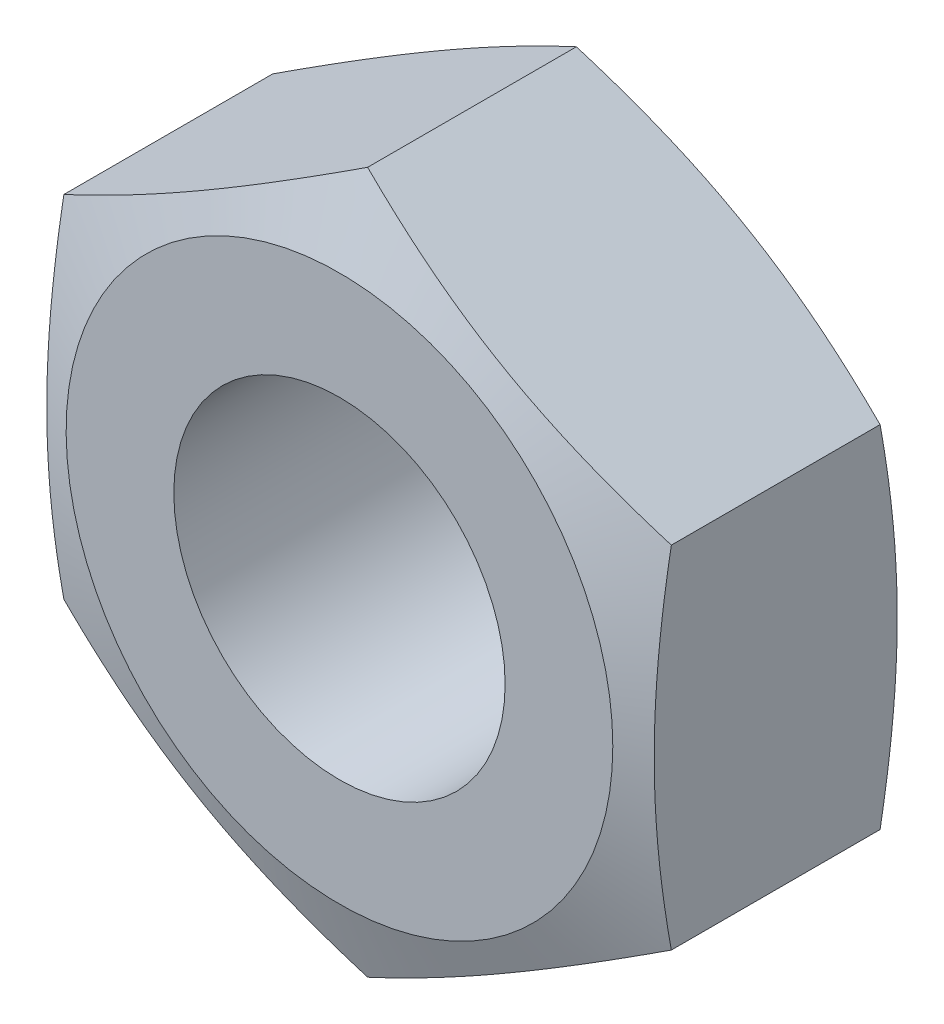
ISO-10303-21;
HEADER;
FILE_DESCRIPTION(('STEP AP214'),'2;1');
FILE_NAME('part.step','',(''),(''),'','','');
FILE_SCHEMA(('AUTOMOTIVE_DESIGN { 1 0 10303 214 1 1 1 1 }'));
ENDSEC;
DATA;
#1=APPLICATION_CONTEXT('core data for automotive mechanical design processes');
#2=APPLICATION_PROTOCOL_DEFINITION('international standard','automotive_design',2000,#1);
#3=PRODUCT_CONTEXT('',#1,'mechanical');
#4=PRODUCT('Part','Part','',(#3));
#5=PRODUCT_RELATED_PRODUCT_CATEGORY('part','',(#4));
#6=PRODUCT_DEFINITION_FORMATION('','',#4);
#7=PRODUCT_DEFINITION_CONTEXT('part definition',#1,'design');
#8=PRODUCT_DEFINITION('design','',#6,#7);
#9=PRODUCT_DEFINITION_SHAPE('','',#8);
#10=(LENGTH_UNIT() NAMED_UNIT(*) SI_UNIT(.MILLI.,.METRE.));
#11=(NAMED_UNIT(*) PLANE_ANGLE_UNIT() SI_UNIT($,.RADIAN.));
#12=(NAMED_UNIT(*) SI_UNIT($,.STERADIAN.) SOLID_ANGLE_UNIT());
#13=UNCERTAINTY_MEASURE_WITH_UNIT(LENGTH_MEASURE(1.E-05),#10,'distance_accuracy_value','');
#14=(GEOMETRIC_REPRESENTATION_CONTEXT(3) GLOBAL_UNCERTAINTY_ASSIGNED_CONTEXT((#13)) GLOBAL_UNIT_ASSIGNED_CONTEXT((#10,
#11,#12)) REPRESENTATION_CONTEXT('',''));
#15=CARTESIAN_POINT('',(0.,0.,0.));
#16=DIRECTION('',(0.,0.,1.));
#17=DIRECTION('',(1.,0.,0.));
#18=AXIS2_PLACEMENT_3D('',#15,#16,#17);
#19=CARTESIAN_POINT('',(2.75,1.58771324027147,2.4));
#20=DIRECTION('',(-0.5,-0.866025403784439,0.));
#21=DIRECTION('',(0.866025403784439,-0.5,0.));
#22=AXIS2_PLACEMENT_3D('',#19,#20,#21);
#23=PLANE('',#22);
#24=DIRECTION('',(0.,0.,-1.));
#25=VECTOR('',#24,1.);
#26=CARTESIAN_POINT('',(2.75,1.58771324027147,2.4));
#27=LINE('',#26,#25);
#28=CARTESIAN_POINT('',(2.75,1.58771324027147,2.14506560979054));
#29=VERTEX_POINT('',#28);
#30=CARTESIAN_POINT('',(2.75,1.58771324027147,0.254934390209461));
#31=VERTEX_POINT('',#30);
#32=EDGE_CURVE('E111',#29,#31,#27,.T.);
#33=ORIENTED_EDGE('',*,*,#32,.T.);
#34=CARTESIAN_POINT('',(2.7502,1.58759777021763,0.254976420164342));
#35=CARTESIAN_POINT('',(2.63630000012268,1.6533579658075,0.231031192897424));
#36=CARTESIAN_POINT('',(2.52202437371804,1.71933502947404,0.209248749090023));
#37=CARTESIAN_POINT('',(2.29272998795685,1.85171820481693,0.170925767770384));
#38=CARTESIAN_POINT('',(2.17771071836237,1.9181246110793,0.154389333313849));
#39=CARTESIAN_POINT('',(1.94820567615072,2.05062940898057,0.127642073357742));
#40=CARTESIAN_POINT('',(1.83372514644431,2.11672477362354,0.117372900159257));
#41=CARTESIAN_POINT('',(1.60449633341729,2.2490700905307,0.103599039319051));
#42=CARTESIAN_POINT('',(1.48974816670865,2.31531997546895,0.100091814423204));
#43=CARTESIAN_POINT('',(1.26025183329135,2.44781974534546,0.100091814423204));
#44=CARTESIAN_POINT('',(1.14550366658271,2.51406963028371,0.103599039319051));
#45=CARTESIAN_POINT('',(0.916274853555694,2.64641494719088,0.117372900159256));
#46=CARTESIAN_POINT('',(0.801794323849281,2.71251031183385,0.127642073357742));
#47=CARTESIAN_POINT('',(0.572289281637633,2.84501510973512,0.154389333313849));
#48=CARTESIAN_POINT('',(0.457270012043154,2.91142151599748,0.170925767770384));
#49=CARTESIAN_POINT('',(0.227975626281962,3.04380469134038,0.209248749090023));
#50=CARTESIAN_POINT('',(0.113699999877321,3.10978175500691,0.231031192897424));
#51=CARTESIAN_POINT('',(-0.000199999999998788,3.17554195059678,0.254976420164342));
#52=B_SPLINE_CURVE_WITH_KNOTS('',3,(#34,#35,#36,#37,#38,#39,#40,#41,#42,#43,#44,#45,#46,#47,#48,
#49,#50,#51),.UNSPECIFIED.,.F.,.F.,(4,2,2,2,2,2,2,2,4),(0.,0.401088617558331,0.802490169106869,
1.20009530912777,1.5975512285803,1.99500714803284,2.39261228805374,2.79401383960228,
3.19510245716061),.UNSPECIFIED.);
#53=CARTESIAN_POINT('',(0.,3.17542648054294,0.254934390209461));
#54=VERTEX_POINT('',#53);
#55=EDGE_CURVE('E61',#31,#54,#52,.T.);
#56=ORIENTED_EDGE('',*,*,#55,.T.);
#57=DIRECTION('',(0.,0.,-1.));
#58=VECTOR('',#57,1.);
#59=CARTESIAN_POINT('',(0.,3.17542648054294,2.4));
#60=LINE('',#59,#58);
#61=CARTESIAN_POINT('',(0.,3.17542648054294,2.14506560979054));
#62=VERTEX_POINT('',#61);
#63=EDGE_CURVE('E11',#62,#54,#60,.T.);
#64=ORIENTED_EDGE('',*,*,#63,.F.);
#65=CARTESIAN_POINT('',(-0.000199999999999396,3.17554195059678,2.14502357983566));
#66=CARTESIAN_POINT('',(0.11369999987732,3.10978175500691,2.16896880710258));
#67=CARTESIAN_POINT('',(0.227975626281962,3.04380469134038,2.19075125090998));
#68=CARTESIAN_POINT('',(0.457270012043154,2.91142151599748,2.22907423222962));
#69=CARTESIAN_POINT('',(0.572289281637632,2.84501510973512,2.24561066668615));
#70=CARTESIAN_POINT('',(0.801794323849281,2.71251031183385,2.27235792664226));
#71=CARTESIAN_POINT('',(0.916274853555694,2.64641494719088,2.28262709984074));
#72=CARTESIAN_POINT('',(1.14550366658271,2.51406963028371,2.29640096068095));
#73=CARTESIAN_POINT('',(1.26025183329135,2.44781974534546,2.2999081855768));
#74=CARTESIAN_POINT('',(1.48974816670865,2.31531997546895,2.2999081855768));
#75=CARTESIAN_POINT('',(1.60449633341729,2.2490700905307,2.29640096068095));
#76=CARTESIAN_POINT('',(1.83372514644431,2.11672477362354,2.28262709984074));
#77=CARTESIAN_POINT('',(1.94820567615072,2.05062940898057,2.27235792664226));
#78=CARTESIAN_POINT('',(2.17771071836237,1.9181246110793,2.24561066668615));
#79=CARTESIAN_POINT('',(2.29272998795685,1.85171820481693,2.22907423222962));
#80=CARTESIAN_POINT('',(2.52202437371804,1.71933502947404,2.19075125090998));
#81=CARTESIAN_POINT('',(2.63630000012268,1.6533579658075,2.16896880710258));
#82=CARTESIAN_POINT('',(2.7502,1.58759777021763,2.14502357983566));
#83=B_SPLINE_CURVE_WITH_KNOTS('',3,(#65,#66,#67,#68,#69,#70,#71,#72,#73,#74,#75,#76,#77,#78,#79,
#80,#81,#82),.UNSPECIFIED.,.F.,.F.,(4,2,2,2,2,2,2,2,4),(0.,0.401088617558331,0.802490169106869,
1.20009530912777,1.5975512285803,1.99500714803284,2.39261228805374,2.79401383960228,
3.19510245716061),.UNSPECIFIED.);
#84=EDGE_CURVE('E120',#62,#29,#83,.T.);
#85=ORIENTED_EDGE('',*,*,#84,.T.);
#86=EDGE_LOOP('',(#33,#56,#64,#85));
#87=FACE_BOUND('',#86,.T.);
#88=ADVANCED_FACE('F45',(#87),#23,.F.);
#89=CARTESIAN_POINT('',(0.,3.17542648054294,2.4));
#90=DIRECTION('',(0.5,-0.866025403784439,0.));
#91=DIRECTION('',(0.866025403784439,0.5,0.));
#92=AXIS2_PLACEMENT_3D('',#89,#90,#91);
#93=PLANE('',#92);
#94=ORIENTED_EDGE('',*,*,#63,.T.);
#95=CARTESIAN_POINT('',(0.000200000000000659,3.17554195059678,0.254976420164342));
#96=CARTESIAN_POINT('',(-0.113699999877319,3.10978175500691,0.231031192897424));
#97=CARTESIAN_POINT('',(-0.227975626281961,3.04380469134038,0.209248749090023));
#98=CARTESIAN_POINT('',(-0.457270012043153,2.91142151599748,0.170925767770384));
#99=CARTESIAN_POINT('',(-0.572289281637632,2.84501510973512,0.154389333313849));
#100=CARTESIAN_POINT('',(-0.80179432384928,2.71251031183385,0.127642073357742));
#101=CARTESIAN_POINT('',(-0.916274853555693,2.64641494719088,0.117372900159256));
#102=CARTESIAN_POINT('',(-1.14550366658271,2.51406963028371,0.103599039319051));
#103=CARTESIAN_POINT('',(-1.26025183329135,2.44781974534546,0.100091814423204));
#104=CARTESIAN_POINT('',(-1.48974816670865,2.31531997546895,0.100091814423204));
#105=CARTESIAN_POINT('',(-1.60449633341729,2.2490700905307,0.103599039319051));
#106=CARTESIAN_POINT('',(-1.83372514644431,2.11672477362354,0.117372900159256));
#107=CARTESIAN_POINT('',(-1.94820567615072,2.05062940898057,0.127642073357742));
#108=CARTESIAN_POINT('',(-2.17771071836237,1.9181246110793,0.154389333313849));
#109=CARTESIAN_POINT('',(-2.29272998795685,1.85171820481693,0.170925767770384));
#110=CARTESIAN_POINT('',(-2.52202437371804,1.71933502947404,0.209248749090023));
#111=CARTESIAN_POINT('',(-2.63630000012268,1.6533579658075,0.231031192897424));
#112=CARTESIAN_POINT('',(-2.7502,1.58759777021763,0.254976420164342));
#113=B_SPLINE_CURVE_WITH_KNOTS('',3,(#95,#96,#97,#98,#99,#100,#101,#102,#103,#104,#105,#106,
#107,#108,#109,#110,#111,#112),.UNSPECIFIED.,.F.,.F.,(4,2,2,2,2,2,2,2,4),(0.,0.401088617558331,
0.802490169106869,1.20009530912777,1.5975512285803,1.99500714803284,2.39261228805374,
2.79401383960228,3.19510245716061),.UNSPECIFIED.);
#114=CARTESIAN_POINT('',(-2.75,1.58771324027147,0.254934390209461));
#115=VERTEX_POINT('',#114);
#116=EDGE_CURVE('E97',#54,#115,#113,.T.);
#117=ORIENTED_EDGE('',*,*,#116,.T.);
#118=DIRECTION('',(0.,0.,-1.));
#119=VECTOR('',#118,1.);
#120=CARTESIAN_POINT('',(-2.75,1.58771324027147,2.4));
#121=LINE('',#120,#119);
#122=CARTESIAN_POINT('',(-2.75,1.58771324027147,2.14506560979054));
#123=VERTEX_POINT('',#122);
#124=EDGE_CURVE('E54',#123,#115,#121,.T.);
#125=ORIENTED_EDGE('',*,*,#124,.F.);
#126=CARTESIAN_POINT('',(-2.7502,1.58759777021763,2.14502357983566));
#127=CARTESIAN_POINT('',(-2.63630000012268,1.6533579658075,2.16896880710258));
#128=CARTESIAN_POINT('',(-2.52202437371804,1.71933502947404,2.19075125090998));
#129=CARTESIAN_POINT('',(-2.29272998795685,1.85171820481693,2.22907423222962));
#130=CARTESIAN_POINT('',(-2.17771071836237,1.9181246110793,2.24561066668615));
#131=CARTESIAN_POINT('',(-1.94820567615072,2.05062940898057,2.27235792664226));
#132=CARTESIAN_POINT('',(-1.83372514644431,2.11672477362354,2.28262709984074));
#133=CARTESIAN_POINT('',(-1.60449633341729,2.2490700905307,2.29640096068095));
#134=CARTESIAN_POINT('',(-1.48974816670865,2.31531997546895,2.2999081855768));
#135=CARTESIAN_POINT('',(-1.26025183329135,2.44781974534546,2.2999081855768));
#136=CARTESIAN_POINT('',(-1.14550366658271,2.51406963028371,2.29640096068095));
#137=CARTESIAN_POINT('',(-0.916274853555693,2.64641494719088,2.28262709984074));
#138=CARTESIAN_POINT('',(-0.80179432384928,2.71251031183385,2.27235792664226));
#139=CARTESIAN_POINT('',(-0.572289281637632,2.84501510973512,2.24561066668615));
#140=CARTESIAN_POINT('',(-0.457270012043153,2.91142151599748,2.22907423222962));
#141=CARTESIAN_POINT('',(-0.227975626281961,3.04380469134038,2.19075125090998));
#142=CARTESIAN_POINT('',(-0.113699999877319,3.10978175500691,2.16896880710258));
#143=CARTESIAN_POINT('',(0.000200000000000502,3.17554195059678,2.14502357983566));
#144=B_SPLINE_CURVE_WITH_KNOTS('',3,(#126,#127,#128,#129,#130,#131,#132,#133,#134,#135,#136,
#137,#138,#139,#140,#141,#142,#143),.UNSPECIFIED.,.F.,.F.,(4,2,2,2,2,2,2,2,4),(0.,
0.401088617558331,0.802490169106869,1.20009530912777,1.5975512285803,1.99500714803284,
2.39261228805374,2.79401383960228,3.19510245716061),.UNSPECIFIED.);
#145=EDGE_CURVE('E117',#123,#62,#144,.T.);
#146=ORIENTED_EDGE('',*,*,#145,.T.);
#147=EDGE_LOOP('',(#94,#117,#125,#146));
#148=FACE_BOUND('',#147,.T.);
#149=ADVANCED_FACE('F116',(#148),#93,.F.);
#150=CARTESIAN_POINT('',(-2.75,1.58771324027147,2.4));
#151=DIRECTION('',(1.,0.,0.));
#152=DIRECTION('',(0.,0.,-1.));
#153=AXIS2_PLACEMENT_3D('',#150,#151,#152);
#154=PLANE('',#153);
#155=ORIENTED_EDGE('',*,*,#124,.T.);
#156=CARTESIAN_POINT('',(-2.75,-4.19417848681035,0.924608067395843));
#157=CARTESIAN_POINT('',(-2.75,-4.06985546473373,0.886777565299654));
#158=CARTESIAN_POINT('',(-2.75,-3.94539504971663,0.849390661362985));
#159=CARTESIAN_POINT('',(-2.75,-3.69612926102503,0.775749361615494));
#160=CARTESIAN_POINT('',(-2.75,-3.57132386068962,0.739495056157065));
#161=CARTESIAN_POINT('',(-2.75,-3.32108222326464,0.668303375022258));
#162=CARTESIAN_POINT('',(-2.75,-3.1956452407142,0.63336860872389));
#163=CARTESIAN_POINT('',(-2.75,-2.94430409613758,0.565227956867069));
#164=CARTESIAN_POINT('',(-2.75,-2.81839994261423,0.532022040006108));
#165=CARTESIAN_POINT('',(-2.75,-2.56761312441494,0.468166546761497));
#166=CARTESIAN_POINT('',(-2.75,-2.44273734622583,0.43749021870412));
#167=CARTESIAN_POINT('',(-2.75,-2.19237048468598,0.378767894936478));
#168=CARTESIAN_POINT('',(-2.75,-2.06687937350166,0.350722019387179));
#169=CARTESIAN_POINT('',(-2.75,-1.689434893084,0.271493097463515));
#170=CARTESIAN_POINT('',(-2.75,-1.43638322195244,0.225185098456396));
#171=CARTESIAN_POINT('',(-2.75,-1.06897999960608,0.172392304857267));
#172=CARTESIAN_POINT('',(-2.75,-0.955745715062691,0.158081863233036));
#173=CARTESIAN_POINT('',(-2.75,-0.728809305964633,0.133892552347281));
#174=CARTESIAN_POINT('',(-2.75,-0.615107241212262,0.124013133352941));
#175=CARTESIAN_POINT('',(-2.75,-0.387453407370143,0.109156597870006));
#176=CARTESIAN_POINT('',(-2.75,-0.273501850113399,0.104176280799926));
#177=CARTESIAN_POINT('',(-2.75,-0.045488731786096,0.0993714112317035));
#178=CARTESIAN_POINT('',(-2.75,0.0685728285538031,0.0995468247209636));
#179=CARTESIAN_POINT('',(-2.75,0.297153863705112,0.105057656428504));
#180=CARTESIAN_POINT('',(-2.75,0.411672690539947,0.110419507011723));
#181=CARTESIAN_POINT('',(-2.75,0.640375486579992,0.126057325501262));
#182=CARTESIAN_POINT('',(-2.75,0.754559435285227,0.136333588182456));
#183=CARTESIAN_POINT('',(-2.75,0.982531459541171,0.161320255264675));
#184=CARTESIAN_POINT('',(-2.75,1.09631912219046,0.176034375588924));
#185=CARTESIAN_POINT('',(-2.75,1.32332358825772,0.209306822105329));
#186=CARTESIAN_POINT('',(-2.75,1.43654038894793,0.227865166648586));
#187=CARTESIAN_POINT('',(-2.75,1.78888144027646,0.290804316537254));
#188=CARTESIAN_POINT('',(-2.75,2.02699523980081,0.340825748342087));
#189=CARTESIAN_POINT('',(-2.75,2.50100513742511,0.450481595760774));
#190=CARTESIAN_POINT('',(-2.75,2.73690039397465,0.510119514917867));
#191=CARTESIAN_POINT('',(-2.75,3.20729423764029,0.635790154749581));
#192=CARTESIAN_POINT('',(-2.75,3.44179060444752,0.701831106421546));
#193=CARTESIAN_POINT('',(-2.75,3.9094980254082,0.838140503058933));
#194=CARTESIAN_POINT('',(-2.75,4.14270927953958,0.908408268772681));
#195=CARTESIAN_POINT('',(-2.75,4.6055758677325,1.05104781680041));
#196=CARTESIAN_POINT('',(-2.75,4.83524144515194,1.12338651081954));
#197=CARTESIAN_POINT('',(-2.75,5.29393000910974,1.27010445993842));
#198=CARTESIAN_POINT('',(-2.75,5.52295296385933,1.34448381408873));
#199=CARTESIAN_POINT('',(-2.75,5.97963900178325,1.49444293537122));
#200=CARTESIAN_POINT('',(-2.75,6.20730394330542,1.57001705731216));
#201=CARTESIAN_POINT('',(-2.75,6.66223695781986,1.72228951531698));
#202=CARTESIAN_POINT('',(-2.75,6.88950506203839,1.79898775801079));
#203=CARTESIAN_POINT('',(-2.75,7.11663788189976,1.87607895499082));
#204=B_SPLINE_CURVE_WITH_KNOTS('',3,(#156,#157,#158,#159,#160,#161,#162,#163,#164,#165,#166,
#167,#168,#169,#170,#171,#172,#173,#174,#175,#176,#177,#178,#179,#180,#181,#182,#183,#184,#185,
#186,#187,#188,#189,#190,#191,#192,#193,#194,#195,#196,#197,#198,#199,#200,#201,#202,#203),
.UNSPECIFIED.,.F.,.F.,(4,2,2,2,2,2,2,2,2,2,2,2,2,2,2,2,2,2,2,2,2,2,2,4),(0.,0.389856706007591,
0.779744433601227,1.17036660217472,1.5609816956906,1.94671730374342,2.33247052390323,
3.10358264153588,3.4459177762599,3.7882104275741,4.13027931041756,4.47234593661703,
4.8161651203103,5.16000492945547,5.50413344688953,5.84826360712131,6.57784013526451,
7.30768307069857,8.03847697097936,8.76915374434801,9.49150661808485,10.2138946159905,
10.9335336193448,11.6531131840965),.UNSPECIFIED.);
#205=CARTESIAN_POINT('',(-2.75,-1.58771324027147,0.254934390209461));
#206=VERTEX_POINT('',#205);
#207=EDGE_CURVE('E100',#115,#206,#204,.F.);
#208=ORIENTED_EDGE('',*,*,#207,.T.);
#209=DIRECTION('',(0.,0.,-1.));
#210=VECTOR('',#209,1.);
#211=CARTESIAN_POINT('',(-2.75,-1.58771324027147,2.4));
#212=LINE('',#211,#210);
#213=CARTESIAN_POINT('',(-2.75,-1.58771324027147,2.14506560979054));
#214=VERTEX_POINT('',#213);
#215=EDGE_CURVE('E238',#214,#206,#212,.T.);
#216=ORIENTED_EDGE('',*,*,#215,.F.);
#217=CARTESIAN_POINT('',(-2.75,-4.19417848681035,1.47539193260416));
#218=CARTESIAN_POINT('',(-2.75,-4.06985546473373,1.51322243470035));
#219=CARTESIAN_POINT('',(-2.75,-3.94539504971663,1.55060933863702));
#220=CARTESIAN_POINT('',(-2.75,-3.69612926102503,1.62425063838451));
#221=CARTESIAN_POINT('',(-2.75,-3.57132386068961,1.66050494384294));
#222=CARTESIAN_POINT('',(-2.75,-3.32108222326464,1.73169662497774));
#223=CARTESIAN_POINT('',(-2.75,-3.1956452407142,1.76663139127611));
#224=CARTESIAN_POINT('',(-2.75,-2.94430409613758,1.83477204313293));
#225=CARTESIAN_POINT('',(-2.75,-2.81839994261423,1.86797795999389));
#226=CARTESIAN_POINT('',(-2.75,-2.56761312441493,1.9318334532385));
#227=CARTESIAN_POINT('',(-2.75,-2.44273734622583,1.96250978129588));
#228=CARTESIAN_POINT('',(-2.75,-2.19237048468598,2.02123210506352));
#229=CARTESIAN_POINT('',(-2.75,-2.06687937350166,2.04927798061282));
#230=CARTESIAN_POINT('',(-2.75,-1.689434893084,2.12850690253649));
#231=CARTESIAN_POINT('',(-2.75,-1.43638322195244,2.1748149015436));
#232=CARTESIAN_POINT('',(-2.75,-1.06897999960608,2.22760769514273));
#233=CARTESIAN_POINT('',(-2.75,-0.955745715062691,2.24191813676696));
#234=CARTESIAN_POINT('',(-2.75,-0.728809305964633,2.26610744765272));
#235=CARTESIAN_POINT('',(-2.75,-0.615107241212262,2.27598686664706));
#236=CARTESIAN_POINT('',(-2.75,-0.387453407370143,2.29084340212999));
#237=CARTESIAN_POINT('',(-2.75,-0.273501850113399,2.29582371920007));
#238=CARTESIAN_POINT('',(-2.75,-0.045488731786096,2.3006285887683));
#239=CARTESIAN_POINT('',(-2.75,0.0685728285538032,2.30045317527904));
#240=CARTESIAN_POINT('',(-2.75,0.297153863705112,2.2949423435715));
#241=CARTESIAN_POINT('',(-2.75,0.411672690539947,2.28958049298828));
#242=CARTESIAN_POINT('',(-2.75,0.640375486579993,2.27394267449874));
#243=CARTESIAN_POINT('',(-2.75,0.754559435285228,2.26366641181754));
#244=CARTESIAN_POINT('',(-2.75,0.982531459541172,2.23867974473532));
#245=CARTESIAN_POINT('',(-2.75,1.09631912219046,2.22396562441108));
#246=CARTESIAN_POINT('',(-2.75,1.32332358825772,2.19069317789467));
#247=CARTESIAN_POINT('',(-2.75,1.43654038894793,2.17213483335141));
#248=CARTESIAN_POINT('',(-2.75,1.78888144027646,2.10919568346275));
#249=CARTESIAN_POINT('',(-2.75,2.02699523980081,2.05917425165791));
#250=CARTESIAN_POINT('',(-2.75,2.50100513742511,1.94951840423923));
#251=CARTESIAN_POINT('',(-2.75,2.73690039397465,1.88988048508213));
#252=CARTESIAN_POINT('',(-2.75,3.2072942376403,1.76420984525042));
#253=CARTESIAN_POINT('',(-2.75,3.44179060444752,1.69816889357845));
#254=CARTESIAN_POINT('',(-2.75,3.9094980254082,1.56185949694107));
#255=CARTESIAN_POINT('',(-2.75,4.14270927953959,1.49159173122732));
#256=CARTESIAN_POINT('',(-2.75,4.60557586773251,1.34895218319959));
#257=CARTESIAN_POINT('',(-2.75,4.83524144515194,1.27661348918046));
#258=CARTESIAN_POINT('',(-2.75,5.29393000910974,1.12989554006158));
#259=CARTESIAN_POINT('',(-2.75,5.52295296385933,1.05551618591127));
#260=CARTESIAN_POINT('',(-2.75,5.97963900178325,0.905557064628776));
#261=CARTESIAN_POINT('',(-2.75,6.20730394330542,0.829982942687836));
#262=CARTESIAN_POINT('',(-2.75,6.66223695781986,0.677710484683022));
#263=CARTESIAN_POINT('',(-2.75,6.88950506203839,0.601012241989205));
#264=CARTESIAN_POINT('',(-2.75,7.11663788189976,0.523921045009179));
#265=B_SPLINE_CURVE_WITH_KNOTS('',3,(#217,#218,#219,#220,#221,#222,#223,#224,#225,#226,#227,
#228,#229,#230,#231,#232,#233,#234,#235,#236,#237,#238,#239,#240,#241,#242,#243,#244,#245,#246,
#247,#248,#249,#250,#251,#252,#253,#254,#255,#256,#257,#258,#259,#260,#261,#262,#263,#264),
.UNSPECIFIED.,.F.,.F.,(4,2,2,2,2,2,2,2,2,2,2,2,2,2,2,2,2,2,2,2,2,2,2,4),(0.,0.389856706007591,
0.779744433601228,1.17036660217473,1.5609816956906,1.94671730374342,2.33247052390323,
3.10358264153588,3.4459177762599,3.78821042757409,4.13027931041756,4.47234593661703,
4.8161651203103,5.16000492945547,5.50413344688953,5.84826360712131,6.57784013526451,
7.30768307069857,8.03847697097937,8.76915374434802,9.49150661808485,10.2138946159905,
10.9335336193448,11.6531131840965),.UNSPECIFIED.);
#266=EDGE_CURVE('E121',#214,#123,#265,.T.);
#267=ORIENTED_EDGE('',*,*,#266,.T.);
#268=EDGE_LOOP('',(#155,#208,#216,#267));
#269=FACE_BOUND('',#268,.T.);
#270=ADVANCED_FACE('F186',(#269),#154,.F.);
#271=CARTESIAN_POINT('',(-2.75,-1.58771324027147,2.4));
#272=DIRECTION('',(0.5,0.866025403784439,0.));
#273=DIRECTION('',(-0.866025403784439,0.5,0.));
#274=AXIS2_PLACEMENT_3D('',#271,#272,#273);
#275=PLANE('',#274);
#276=ORIENTED_EDGE('',*,*,#215,.T.);
#277=CARTESIAN_POINT('',(-2.7502,-1.58759777021763,0.254976420164342));
#278=CARTESIAN_POINT('',(-2.63630000012268,-1.6533579658075,0.231031192897424));
#279=CARTESIAN_POINT('',(-2.52202437371804,-1.71933502947403,0.209248749090023));
#280=CARTESIAN_POINT('',(-2.29272998795685,-1.85171820481693,0.170925767770384));
#281=CARTESIAN_POINT('',(-2.17771071836237,-1.91812461107929,0.154389333313849));
#282=CARTESIAN_POINT('',(-1.94820567615072,-2.05062940898057,0.127642073357742));
#283=CARTESIAN_POINT('',(-1.83372514644431,-2.11672477362354,0.117372900159256));
#284=CARTESIAN_POINT('',(-1.60449633341729,-2.2490700905307,0.103599039319051));
#285=CARTESIAN_POINT('',(-1.48974816670865,-2.31531997546895,0.100091814423204));
#286=CARTESIAN_POINT('',(-1.26025183329135,-2.44781974534546,0.100091814423204));
#287=CARTESIAN_POINT('',(-1.14550366658271,-2.51406963028371,0.103599039319051));
#288=CARTESIAN_POINT('',(-0.916274853555694,-2.64641494719088,0.117372900159256));
#289=CARTESIAN_POINT('',(-0.80179432384928,-2.71251031183385,0.127642073357742));
#290=CARTESIAN_POINT('',(-0.572289281637632,-2.84501510973512,0.154389333313849));
#291=CARTESIAN_POINT('',(-0.457270012043153,-2.91142151599748,0.170925767770384));
#292=CARTESIAN_POINT('',(-0.227975626281961,-3.04380469134038,0.209248749090023));
#293=CARTESIAN_POINT('',(-0.113699999877319,-3.10978175500691,0.231031192897424));
#294=CARTESIAN_POINT('',(0.000200000000000454,-3.17554195059678,0.254976420164342));
#295=B_SPLINE_CURVE_WITH_KNOTS('',3,(#277,#278,#279,#280,#281,#282,#283,#284,#285,#286,#287,
#288,#289,#290,#291,#292,#293,#294),.UNSPECIFIED.,.F.,.F.,(4,2,2,2,2,2,2,2,4),(0.,
0.401088617558331,0.802490169106869,1.20009530912777,1.5975512285803,1.99500714803284,
2.39261228805374,2.79401383960228,3.19510245716061),.UNSPECIFIED.);
#296=CARTESIAN_POINT('',(0.,-3.17542648054294,0.254934390209461));
#297=VERTEX_POINT('',#296);
#298=EDGE_CURVE('E192',#206,#297,#295,.T.);
#299=ORIENTED_EDGE('',*,*,#298,.T.);
#300=DIRECTION('',(0.,0.,-1.));
#301=VECTOR('',#300,1.);
#302=CARTESIAN_POINT('',(0.,-3.17542648054294,2.4));
#303=LINE('',#302,#301);
#304=CARTESIAN_POINT('',(0.,-3.17542648054294,2.14506560979054));
#305=VERTEX_POINT('',#304);
#306=EDGE_CURVE('E233',#305,#297,#303,.T.);
#307=ORIENTED_EDGE('',*,*,#306,.F.);
#308=CARTESIAN_POINT('',(0.000199999999999939,-3.17554195059678,2.14502357983566));
#309=CARTESIAN_POINT('',(-0.113699999877319,-3.10978175500691,2.16896880710258));
#310=CARTESIAN_POINT('',(-0.227975626281961,-3.04380469134038,2.19075125090998));
#311=CARTESIAN_POINT('',(-0.457270012043153,-2.91142151599748,2.22907423222962));
#312=CARTESIAN_POINT('',(-0.572289281637632,-2.84501510973512,2.24561066668615));
#313=CARTESIAN_POINT('',(-0.801794323849281,-2.71251031183384,2.27235792664226));
#314=CARTESIAN_POINT('',(-0.916274853555694,-2.64641494719088,2.28262709984074));
#315=CARTESIAN_POINT('',(-1.14550366658271,-2.51406963028371,2.29640096068095));
#316=CARTESIAN_POINT('',(-1.26025183329135,-2.44781974534546,2.2999081855768));
#317=CARTESIAN_POINT('',(-1.48974816670865,-2.31531997546895,2.2999081855768));
#318=CARTESIAN_POINT('',(-1.60449633341729,-2.2490700905307,2.29640096068095));
#319=CARTESIAN_POINT('',(-1.83372514644431,-2.11672477362354,2.28262709984074));
#320=CARTESIAN_POINT('',(-1.94820567615072,-2.05062940898057,2.27235792664226));
#321=CARTESIAN_POINT('',(-2.17771071836237,-1.91812461107929,2.24561066668615));
#322=CARTESIAN_POINT('',(-2.29272998795685,-1.85171820481693,2.22907423222962));
#323=CARTESIAN_POINT('',(-2.52202437371804,-1.71933502947403,2.19075125090998));
#324=CARTESIAN_POINT('',(-2.63630000012268,-1.6533579658075,2.16896880710258));
#325=CARTESIAN_POINT('',(-2.7502,-1.58759777021763,2.14502357983566));
#326=B_SPLINE_CURVE_WITH_KNOTS('',3,(#308,#309,#310,#311,#312,#313,#314,#315,#316,#317,#318,
#319,#320,#321,#322,#323,#324,#325),.UNSPECIFIED.,.F.,.F.,(4,2,2,2,2,2,2,2,4),(0.,
0.401088617558332,0.802490169106869,1.20009530912777,1.59755122858031,1.99500714803284,
2.39261228805374,2.79401383960228,3.19510245716061),.UNSPECIFIED.);
#327=EDGE_CURVE('E126',#305,#214,#326,.T.);
#328=ORIENTED_EDGE('',*,*,#327,.T.);
#329=EDGE_LOOP('',(#276,#299,#307,#328));
#330=FACE_BOUND('',#329,.T.);
#331=ADVANCED_FACE('F182',(#330),#275,.F.);
#332=CARTESIAN_POINT('',(0.,-3.17542648054294,2.4));
#333=DIRECTION('',(-0.5,0.866025403784439,0.));
#334=DIRECTION('',(-0.866025403784439,-0.5,0.));
#335=AXIS2_PLACEMENT_3D('',#332,#333,#334);
#336=PLANE('',#335);
#337=ORIENTED_EDGE('',*,*,#306,.T.);
#338=CARTESIAN_POINT('',(-0.000200000000000115,-3.17554195059678,0.254976420164341));
#339=CARTESIAN_POINT('',(0.113699999877319,-3.10978175500691,0.231031192897424));
#340=CARTESIAN_POINT('',(0.227975626281961,-3.04380469134038,0.209248749090023));
#341=CARTESIAN_POINT('',(0.457270012043153,-2.91142151599748,0.170925767770384));
#342=CARTESIAN_POINT('',(0.572289281637632,-2.84501510973512,0.154389333313849));
#343=CARTESIAN_POINT('',(0.801794323849281,-2.71251031183384,0.127642073357742));
#344=CARTESIAN_POINT('',(0.916274853555694,-2.64641494719088,0.117372900159256));
#345=CARTESIAN_POINT('',(1.14550366658271,-2.51406963028371,0.103599039319051));
#346=CARTESIAN_POINT('',(1.26025183329135,-2.44781974534546,0.100091814423204));
#347=CARTESIAN_POINT('',(1.48974816670865,-2.31531997546895,0.100091814423204));
#348=CARTESIAN_POINT('',(1.60449633341729,-2.2490700905307,0.103599039319051));
#349=CARTESIAN_POINT('',(1.83372514644431,-2.11672477362354,0.117372900159256));
#350=CARTESIAN_POINT('',(1.94820567615072,-2.05062940898057,0.127642073357742));
#351=CARTESIAN_POINT('',(2.17771071836237,-1.9181246110793,0.154389333313849));
#352=CARTESIAN_POINT('',(2.29272998795685,-1.85171820481693,0.170925767770384));
#353=CARTESIAN_POINT('',(2.52202437371804,-1.71933502947404,0.209248749090023));
#354=CARTESIAN_POINT('',(2.63630000012268,-1.6533579658075,0.231031192897424));
#355=CARTESIAN_POINT('',(2.7502,-1.58759777021763,0.254976420164342));
#356=B_SPLINE_CURVE_WITH_KNOTS('',3,(#338,#339,#340,#341,#342,#343,#344,#345,#346,#347,#348,
#349,#350,#351,#352,#353,#354,#355),.UNSPECIFIED.,.F.,.F.,(4,2,2,2,2,2,2,2,4),(0.,
0.401088617558331,0.802490169106869,1.20009530912777,1.5975512285803,1.99500714803284,
2.39261228805374,2.79401383960228,3.19510245716061),.UNSPECIFIED.);
#357=CARTESIAN_POINT('',(2.75,-1.58771324027147,0.254934390209461));
#358=VERTEX_POINT('',#357);
#359=EDGE_CURVE('E201',#297,#358,#356,.T.);
#360=ORIENTED_EDGE('',*,*,#359,.T.);
#361=DIRECTION('',(0.,0.,-1.));
#362=VECTOR('',#361,1.);
#363=CARTESIAN_POINT('',(2.75,-1.58771324027147,2.4));
#364=LINE('',#363,#362);
#365=CARTESIAN_POINT('',(2.75,-1.58771324027147,2.14506560979054));
#366=VERTEX_POINT('',#365);
#367=EDGE_CURVE('E234',#366,#358,#364,.T.);
#368=ORIENTED_EDGE('',*,*,#367,.F.);
#369=CARTESIAN_POINT('',(2.7502,-1.58759777021763,2.14502357983566));
#370=CARTESIAN_POINT('',(2.63630000012268,-1.6533579658075,2.16896880710258));
#371=CARTESIAN_POINT('',(2.52202437371804,-1.71933502947404,2.19075125090998));
#372=CARTESIAN_POINT('',(2.29272998795685,-1.85171820481693,2.22907423222962));
#373=CARTESIAN_POINT('',(2.17771071836237,-1.9181246110793,2.24561066668615));
#374=CARTESIAN_POINT('',(1.94820567615072,-2.05062940898057,2.27235792664226));
#375=CARTESIAN_POINT('',(1.83372514644431,-2.11672477362354,2.28262709984074));
#376=CARTESIAN_POINT('',(1.60449633341729,-2.2490700905307,2.29640096068095));
#377=CARTESIAN_POINT('',(1.48974816670865,-2.31531997546895,2.2999081855768));
#378=CARTESIAN_POINT('',(1.26025183329135,-2.44781974534546,2.2999081855768));
#379=CARTESIAN_POINT('',(1.14550366658271,-2.51406963028371,2.29640096068095));
#380=CARTESIAN_POINT('',(0.916274853555693,-2.64641494719088,2.28262709984074));
#381=CARTESIAN_POINT('',(0.80179432384928,-2.71251031183385,2.27235792664226));
#382=CARTESIAN_POINT('',(0.572289281637632,-2.84501510973512,2.24561066668615));
#383=CARTESIAN_POINT('',(0.457270012043153,-2.91142151599748,2.22907423222962));
#384=CARTESIAN_POINT('',(0.227975626281961,-3.04380469134038,2.19075125090998));
#385=CARTESIAN_POINT('',(0.113699999877319,-3.10978175500691,2.16896880710258));
#386=CARTESIAN_POINT('',(-0.000200000000000459,-3.17554195059678,2.14502357983566));
#387=B_SPLINE_CURVE_WITH_KNOTS('',3,(#369,#370,#371,#372,#373,#374,#375,#376,#377,#378,#379,
#380,#381,#382,#383,#384,#385,#386),.UNSPECIFIED.,.F.,.F.,(4,2,2,2,2,2,2,2,4),(0.,
0.401088617558331,0.802490169106869,1.20009530912777,1.5975512285803,1.99500714803284,
2.39261228805374,2.79401383960228,3.19510245716061),.UNSPECIFIED.);
#388=EDGE_CURVE('E69',#366,#305,#387,.T.);
#389=ORIENTED_EDGE('',*,*,#388,.T.);
#390=EDGE_LOOP('',(#337,#360,#368,#389));
#391=FACE_BOUND('',#390,.T.);
#392=ADVANCED_FACE('F185',(#391),#336,.F.);
#393=CARTESIAN_POINT('',(2.75,-1.58771324027147,2.4));
#394=DIRECTION('',(-1.,0.,0.));
#395=DIRECTION('',(0.,-1.,0.));
#396=AXIS2_PLACEMENT_3D('',#393,#394,#395);
#397=PLANE('',#396);
#398=ORIENTED_EDGE('',*,*,#367,.T.);
#399=CARTESIAN_POINT('',(2.75,-4.19417848681035,0.924608067395843));
#400=CARTESIAN_POINT('',(2.75,-4.06985546473373,0.886777565299654));
#401=CARTESIAN_POINT('',(2.75,-3.94539504971663,0.849390661362985));
#402=CARTESIAN_POINT('',(2.75,-3.69612926102503,0.775749361615495));
#403=CARTESIAN_POINT('',(2.75,-3.57132386068962,0.739495056157065));
#404=CARTESIAN_POINT('',(2.75,-3.32108222326465,0.668303375022259));
#405=CARTESIAN_POINT('',(2.75,-3.19564524071421,0.63336860872389));
#406=CARTESIAN_POINT('',(2.75,-2.94430409613758,0.56522795686707));
#407=CARTESIAN_POINT('',(2.75,-2.81839994261423,0.532022040006108));
#408=CARTESIAN_POINT('',(2.75,-2.56761312441494,0.468166546761498));
#409=CARTESIAN_POINT('',(2.75,-2.44273734622583,0.43749021870412));
#410=CARTESIAN_POINT('',(2.75,-2.19237048468598,0.378767894936478));
#411=CARTESIAN_POINT('',(2.75,-2.06687937350166,0.350722019387179));
#412=CARTESIAN_POINT('',(2.75,-1.689434893084,0.271493097463515));
#413=CARTESIAN_POINT('',(2.75,-1.43638322195244,0.225185098456396));
#414=CARTESIAN_POINT('',(2.75,-1.06897999960608,0.172392304857267));
#415=CARTESIAN_POINT('',(2.75,-0.955745715062692,0.158081863233036));
#416=CARTESIAN_POINT('',(2.75,-0.728809305964634,0.133892552347281));
#417=CARTESIAN_POINT('',(2.75,-0.615107241212263,0.12401313335294));
#418=CARTESIAN_POINT('',(2.75,-0.387453407370144,0.109156597870006));
#419=CARTESIAN_POINT('',(2.75,-0.273501850113399,0.104176280799926));
#420=CARTESIAN_POINT('',(2.75,-0.0454887317860964,0.0993714112317032));
#421=CARTESIAN_POINT('',(2.75,0.0685728285538028,0.0995468247209634));
#422=CARTESIAN_POINT('',(2.75,0.297153863705111,0.105057656428504));
#423=CARTESIAN_POINT('',(2.75,0.411672690539946,0.110419507011722));
#424=CARTESIAN_POINT('',(2.75,0.640375486579992,0.126057325501262));
#425=CARTESIAN_POINT('',(2.75,0.754559435285227,0.136333588182455));
#426=CARTESIAN_POINT('',(2.75,0.982531459541171,0.161320255264674));
#427=CARTESIAN_POINT('',(2.75,1.09631912219046,0.176034375588923));
#428=CARTESIAN_POINT('',(2.75,1.32332358825772,0.209306822105328));
#429=CARTESIAN_POINT('',(2.75,1.43654038894793,0.227865166648585));
#430=CARTESIAN_POINT('',(2.75,1.78888144027646,0.290804316537253));
#431=CARTESIAN_POINT('',(2.75,2.02699523980081,0.340825748342087));
#432=CARTESIAN_POINT('',(2.75,2.50100513742511,0.450481595760773));
#433=CARTESIAN_POINT('',(2.75,2.73690039397465,0.510119514917866));
#434=CARTESIAN_POINT('',(2.75,3.20729423764029,0.63579015474958));
#435=CARTESIAN_POINT('',(2.75,3.44179060444752,0.701831106421546));
#436=CARTESIAN_POINT('',(2.75,3.90949802540819,0.838140503058932));
#437=CARTESIAN_POINT('',(2.75,4.14270927953958,0.90840826877268));
#438=CARTESIAN_POINT('',(2.75,4.6055758677325,1.05104781680041));
#439=CARTESIAN_POINT('',(2.75,4.83524144515194,1.12338651081954));
#440=CARTESIAN_POINT('',(2.75,5.29393000910974,1.27010445993841));
#441=CARTESIAN_POINT('',(2.75,5.52295296385933,1.34448381408873));
#442=CARTESIAN_POINT('',(2.75,5.97963900178325,1.49444293537122));
#443=CARTESIAN_POINT('',(2.75,6.20730394330542,1.57001705731216));
#444=CARTESIAN_POINT('',(2.75,6.66223695781986,1.72228951531698));
#445=CARTESIAN_POINT('',(2.75,6.88950506203839,1.7989877580108));
#446=CARTESIAN_POINT('',(2.75,7.11663788189976,1.87607895499082));
#447=B_SPLINE_CURVE_WITH_KNOTS('',3,(#399,#400,#401,#402,#403,#404,#405,#406,#407,#408,#409,
#410,#411,#412,#413,#414,#415,#416,#417,#418,#419,#420,#421,#422,#423,#424,#425,#426,#427,#428,
#429,#430,#431,#432,#433,#434,#435,#436,#437,#438,#439,#440,#441,#442,#443,#444,#445,#446),
.UNSPECIFIED.,.F.,.F.,(4,2,2,2,2,2,2,2,2,2,2,2,2,2,2,2,2,2,2,2,2,2,2,4),(0.,0.389856706007591,
0.779744433601226,1.17036660217472,1.5609816956906,1.94671730374342,2.33247052390323,
3.10358264153588,3.4459177762599,3.7882104275741,4.13027931041756,4.47234593661703,
4.8161651203103,5.16000492945547,5.50413344688953,5.84826360712131,6.57784013526451,
7.30768307069856,8.03847697097936,8.76915374434801,9.49150661808485,10.2138946159905,
10.9335336193448,11.6531131840965),.UNSPECIFIED.);
#448=EDGE_CURVE('E366',#358,#31,#447,.T.);
#449=ORIENTED_EDGE('',*,*,#448,.T.);
#450=ORIENTED_EDGE('',*,*,#32,.F.);
#451=CARTESIAN_POINT('',(2.75,-4.19417848681035,1.47539193260416));
#452=CARTESIAN_POINT('',(2.75,-4.06985546473373,1.51322243470035));
#453=CARTESIAN_POINT('',(2.75,-3.94539504971663,1.55060933863702));
#454=CARTESIAN_POINT('',(2.75,-3.69612926102503,1.62425063838451));
#455=CARTESIAN_POINT('',(2.75,-3.57132386068962,1.66050494384293));
#456=CARTESIAN_POINT('',(2.75,-3.32108222326465,1.73169662497774));
#457=CARTESIAN_POINT('',(2.75,-3.1956452407142,1.76663139127611));
#458=CARTESIAN_POINT('',(2.75,-2.94430409613758,1.83477204313293));
#459=CARTESIAN_POINT('',(2.75,-2.81839994261423,1.86797795999389));
#460=CARTESIAN_POINT('',(2.75,-2.56761312441494,1.9318334532385));
#461=CARTESIAN_POINT('',(2.75,-2.44273734622583,1.96250978129588));
#462=CARTESIAN_POINT('',(2.75,-2.19237048468598,2.02123210506352));
#463=CARTESIAN_POINT('',(2.75,-2.06687937350166,2.04927798061282));
#464=CARTESIAN_POINT('',(2.75,-1.689434893084,2.12850690253648));
#465=CARTESIAN_POINT('',(2.75,-1.43638322195244,2.1748149015436));
#466=CARTESIAN_POINT('',(2.75,-1.06897999960608,2.22760769514273));
#467=CARTESIAN_POINT('',(2.75,-0.955745715062692,2.24191813676696));
#468=CARTESIAN_POINT('',(2.75,-0.728809305964634,2.26610744765272));
#469=CARTESIAN_POINT('',(2.75,-0.615107241212263,2.27598686664706));
#470=CARTESIAN_POINT('',(2.75,-0.387453407370144,2.29084340212999));
#471=CARTESIAN_POINT('',(2.75,-0.2735018501134,2.29582371920007));
#472=CARTESIAN_POINT('',(2.75,-0.0454887317860964,2.3006285887683));
#473=CARTESIAN_POINT('',(2.75,0.0685728285538026,2.30045317527904));
#474=CARTESIAN_POINT('',(2.75,0.297153863705111,2.2949423435715));
#475=CARTESIAN_POINT('',(2.75,0.411672690539946,2.28958049298828));
#476=CARTESIAN_POINT('',(2.75,0.640375486579991,2.27394267449874));
#477=CARTESIAN_POINT('',(2.75,0.754559435285227,2.26366641181754));
#478=CARTESIAN_POINT('',(2.75,0.982531459541171,2.23867974473533));
#479=CARTESIAN_POINT('',(2.75,1.09631912219046,2.22396562441108));
#480=CARTESIAN_POINT('',(2.75,1.32332358825772,2.19069317789467));
#481=CARTESIAN_POINT('',(2.75,1.43654038894793,2.17213483335141));
#482=CARTESIAN_POINT('',(2.75,1.78888144027646,2.10919568346275));
#483=CARTESIAN_POINT('',(2.75,2.02699523980081,2.05917425165791));
#484=CARTESIAN_POINT('',(2.75,2.50100513742511,1.94951840423923));
#485=CARTESIAN_POINT('',(2.75,2.73690039397465,1.88988048508213));
#486=CARTESIAN_POINT('',(2.75,3.20729423764029,1.76420984525042));
#487=CARTESIAN_POINT('',(2.75,3.44179060444752,1.69816889357845));
#488=CARTESIAN_POINT('',(2.75,3.9094980254082,1.56185949694107));
#489=CARTESIAN_POINT('',(2.75,4.14270927953958,1.49159173122732));
#490=CARTESIAN_POINT('',(2.75,4.6055758677325,1.34895218319959));
#491=CARTESIAN_POINT('',(2.75,4.83524144515194,1.27661348918046));
#492=CARTESIAN_POINT('',(2.75,5.29393000910975,1.12989554006158));
#493=CARTESIAN_POINT('',(2.75,5.52295296385933,1.05551618591127));
#494=CARTESIAN_POINT('',(2.75,5.97963900178326,0.905557064628775));
#495=CARTESIAN_POINT('',(2.75,6.20730394330542,0.829982942687835));
#496=CARTESIAN_POINT('',(2.75,6.66223695781986,0.677710484683021));
#497=CARTESIAN_POINT('',(2.75,6.88950506203839,0.601012241989204));
#498=CARTESIAN_POINT('',(2.75,7.11663788189976,0.523921045009178));
#499=B_SPLINE_CURVE_WITH_KNOTS('',3,(#451,#452,#453,#454,#455,#456,#457,#458,#459,#460,#461,
#462,#463,#464,#465,#466,#467,#468,#469,#470,#471,#472,#473,#474,#475,#476,#477,#478,#479,#480,
#481,#482,#483,#484,#485,#486,#487,#488,#489,#490,#491,#492,#493,#494,#495,#496,#497,#498),
.UNSPECIFIED.,.F.,.F.,(4,2,2,2,2,2,2,2,2,2,2,2,2,2,2,2,2,2,2,2,2,2,2,4),(0.,0.389856706007591,
0.779744433601227,1.17036660217472,1.5609816956906,1.94671730374342,2.33247052390323,
3.10358264153588,3.4459177762599,3.7882104275741,4.13027931041756,4.47234593661703,
4.8161651203103,5.16000492945547,5.50413344688953,5.84826360712132,6.57784013526451,
7.30768307069857,8.03847697097937,8.76915374434802,9.49150661808485,10.2138946159905,
10.9335336193448,11.6531131840965),.UNSPECIFIED.);
#500=EDGE_CURVE('E159',#29,#366,#499,.F.);
#501=ORIENTED_EDGE('',*,*,#500,.T.);
#502=EDGE_LOOP('',(#398,#449,#450,#501));
#503=FACE_BOUND('',#502,.T.);
#504=ADVANCED_FACE('F151',(#503),#397,.F.);
#505=CARTESIAN_POINT('',(0.,0.,2.14506560979054));
#506=DIRECTION('',(0.,0.,-1.));
#507=DIRECTION('',(-1.,0.,0.));
#508=AXIS2_PLACEMENT_3D('',#505,#506,#507);
#509=CONICAL_SURFACE('',#508,3.17542648054294,1.22173047639604);
#510=CARTESIAN_POINT('',(0.,0.,2.4));
#511=DIRECTION('',(0.,0.,1.));
#512=DIRECTION('',(1.,0.,0.));
#513=AXIS2_PLACEMENT_3D('',#510,#511,#512);
#514=CIRCLE('',#513,2.475);
#515=CARTESIAN_POINT('',(2.475,0.,2.4));
#516=VERTEX_POINT('',#515);
#517=EDGE_CURVE('E113',#516,#516,#514,.T.);
#518=ORIENTED_EDGE('',*,*,#517,.F.);
#519=EDGE_LOOP('',(#518));
#520=FACE_BOUND('',#519,.T.);
#521=ORIENTED_EDGE('',*,*,#145,.F.);
#522=ORIENTED_EDGE('',*,*,#266,.F.);
#523=ORIENTED_EDGE('',*,*,#327,.F.);
#524=ORIENTED_EDGE('',*,*,#388,.F.);
#525=ORIENTED_EDGE('',*,*,#500,.F.);
#526=ORIENTED_EDGE('',*,*,#84,.F.);
#527=EDGE_LOOP('',(#521,#522,#523,#524,#525,#526));
#528=FACE_BOUND('',#527,.T.);
#529=ADVANCED_FACE('F145',(#520,#528),#509,.T.);
#530=CARTESIAN_POINT('',(0.,0.,2.4));
#531=DIRECTION('',(0.,0.,1.));
#532=DIRECTION('',(1.,0.,0.));
#533=AXIS2_PLACEMENT_3D('',#530,#531,#532);
#534=PLANE('',#533);
#535=CARTESIAN_POINT('',(0.,0.,2.4));
#536=DIRECTION('',(0.,0.,1.));
#537=DIRECTION('',(1.,0.,0.));
#538=AXIS2_PLACEMENT_3D('',#535,#536,#537);
#539=CIRCLE('',#538,1.5);
#540=CARTESIAN_POINT('',(1.5,0.,2.4));
#541=VERTEX_POINT('',#540);
#542=EDGE_CURVE('E357',#541,#541,#539,.T.);
#543=ORIENTED_EDGE('',*,*,#542,.F.);
#544=EDGE_LOOP('',(#543));
#545=FACE_BOUND('',#544,.T.);
#546=ORIENTED_EDGE('',*,*,#517,.T.);
#547=EDGE_LOOP('',(#546));
#548=FACE_BOUND('',#547,.T.);
#549=ADVANCED_FACE('F150',(#545,#548),#534,.T.);
#550=CARTESIAN_POINT('',(0.,0.,0.254934390209461));
#551=DIRECTION('',(0.,0.,1.));
#552=DIRECTION('',(-1.,0.,0.));
#553=AXIS2_PLACEMENT_3D('',#550,#551,#552);
#554=CONICAL_SURFACE('',#553,3.17542648054294,1.22173047639604);
#555=CARTESIAN_POINT('',(0.,0.,0.));
#556=DIRECTION('',(0.,0.,1.));
#557=DIRECTION('',(1.,0.,0.));
#558=AXIS2_PLACEMENT_3D('',#555,#556,#557);
#559=CIRCLE('',#558,2.475);
#560=CARTESIAN_POINT('',(2.475,0.,0.));
#561=VERTEX_POINT('',#560);
#562=EDGE_CURVE('E361',#561,#561,#559,.T.);
#563=ORIENTED_EDGE('',*,*,#562,.T.);
#564=EDGE_LOOP('',(#563));
#565=FACE_BOUND('',#564,.T.);
#566=ORIENTED_EDGE('',*,*,#448,.F.);
#567=ORIENTED_EDGE('',*,*,#359,.F.);
#568=ORIENTED_EDGE('',*,*,#298,.F.);
#569=ORIENTED_EDGE('',*,*,#207,.F.);
#570=ORIENTED_EDGE('',*,*,#116,.F.);
#571=ORIENTED_EDGE('',*,*,#55,.F.);
#572=EDGE_LOOP('',(#566,#567,#568,#569,#570,#571));
#573=FACE_BOUND('',#572,.T.);
#574=ADVANCED_FACE('F98',(#565,#573),#554,.T.);
#575=CARTESIAN_POINT('',(0.,0.,0.));
#576=DIRECTION('',(0.,0.,1.));
#577=DIRECTION('',(1.,0.,0.));
#578=AXIS2_PLACEMENT_3D('',#575,#576,#577);
#579=PLANE('',#578);
#580=CARTESIAN_POINT('',(0.,0.,0.));
#581=DIRECTION('',(0.,0.,1.));
#582=DIRECTION('',(1.,0.,0.));
#583=AXIS2_PLACEMENT_3D('',#580,#581,#582);
#584=CIRCLE('',#583,1.5);
#585=CARTESIAN_POINT('',(1.5,0.,0.));
#586=VERTEX_POINT('',#585);
#587=EDGE_CURVE('E354',#586,#586,#584,.T.);
#588=ORIENTED_EDGE('',*,*,#587,.T.);
#589=EDGE_LOOP('',(#588));
#590=FACE_BOUND('',#589,.T.);
#591=ORIENTED_EDGE('',*,*,#562,.F.);
#592=EDGE_LOOP('',(#591));
#593=FACE_BOUND('',#592,.T.);
#594=ADVANCED_FACE('F297',(#590,#593),#579,.F.);
#595=CARTESIAN_POINT('',(0.,0.,0.));
#596=DIRECTION('',(0.,0.,1.));
#597=DIRECTION('',(1.,0.,0.));
#598=AXIS2_PLACEMENT_3D('',#595,#596,#597);
#599=CYLINDRICAL_SURFACE('',#598,1.5);
#600=ORIENTED_EDGE('',*,*,#587,.F.);
#601=EDGE_LOOP('',(#600));
#602=FACE_BOUND('',#601,.T.);
#603=ORIENTED_EDGE('',*,*,#542,.T.);
#604=EDGE_LOOP('',(#603));
#605=FACE_BOUND('',#604,.T.);
#606=ADVANCED_FACE('F317',(#602,#605),#599,.F.);
#607=CLOSED_SHELL('',(#88,#149,#270,#331,#392,#504,#529,#549,#574,#594,#606));
#608=MANIFOLD_SOLID_BREP('B2',#607);
#609=ADVANCED_BREP_SHAPE_REPRESENTATION('',(#18,#608),#14);
#610=SHAPE_DEFINITION_REPRESENTATION(#9,#609);
ENDSEC;
END-ISO-10303-21;
